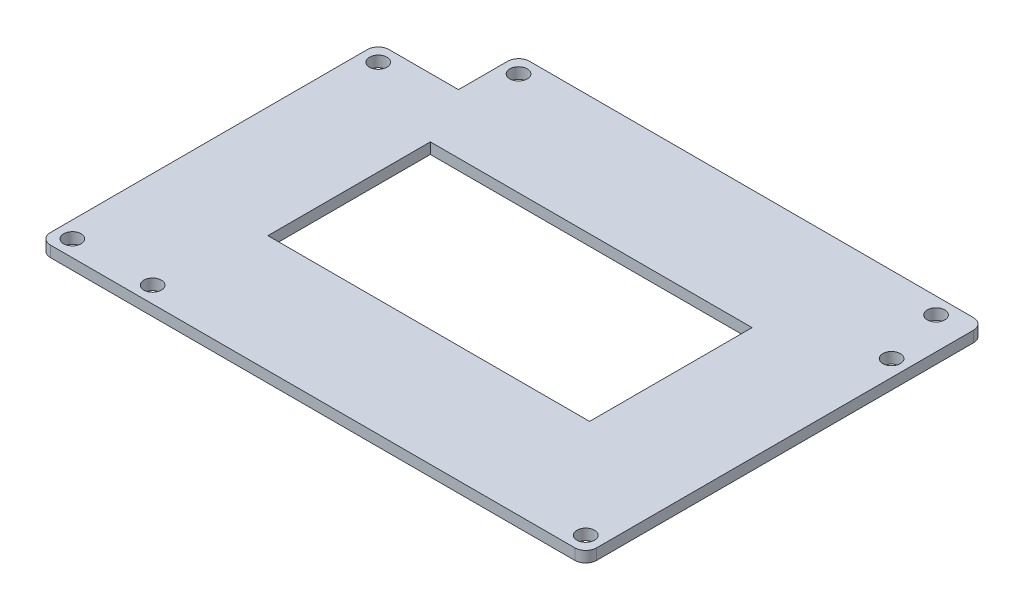
ISO-10303-21;
HEADER;
FILE_DESCRIPTION(('STEP AP214'),'2;1');
FILE_NAME('part.step','',(''),(''),'','','');
FILE_SCHEMA(('AUTOMOTIVE_DESIGN { 1 0 10303 214 1 1 1 1 }'));
ENDSEC;
DATA;
#1=APPLICATION_CONTEXT('core data for automotive mechanical design processes');
#2=APPLICATION_PROTOCOL_DEFINITION('international standard','automotive_design',2000,#1);
#3=PRODUCT_CONTEXT('',#1,'mechanical');
#4=PRODUCT('Part','Part','',(#3));
#5=PRODUCT_RELATED_PRODUCT_CATEGORY('part','',(#4));
#6=PRODUCT_DEFINITION_FORMATION('','',#4);
#7=PRODUCT_DEFINITION_CONTEXT('part definition',#1,'design');
#8=PRODUCT_DEFINITION('design','',#6,#7);
#9=PRODUCT_DEFINITION_SHAPE('','',#8);
#10=(LENGTH_UNIT() NAMED_UNIT(*) SI_UNIT(.MILLI.,.METRE.));
#11=(NAMED_UNIT(*) PLANE_ANGLE_UNIT() SI_UNIT($,.RADIAN.));
#12=(NAMED_UNIT(*) SI_UNIT($,.STERADIAN.) SOLID_ANGLE_UNIT());
#13=UNCERTAINTY_MEASURE_WITH_UNIT(LENGTH_MEASURE(1.E-05),#10,'distance_accuracy_value','');
#14=(GEOMETRIC_REPRESENTATION_CONTEXT(3) GLOBAL_UNCERTAINTY_ASSIGNED_CONTEXT((#13)) GLOBAL_UNIT_ASSIGNED_CONTEXT((#10,
#11,#12)) REPRESENTATION_CONTEXT('',''));
#15=CARTESIAN_POINT('',(0.,0.,0.));
#16=DIRECTION('',(0.,0.,1.));
#17=DIRECTION('',(1.,0.,0.));
#18=AXIS2_PLACEMENT_3D('',#15,#16,#17);
#19=CARTESIAN_POINT('',(50.,2.,0.));
#20=DIRECTION('',(-1.,0.,0.));
#21=DIRECTION('',(0.,0.,1.));
#22=AXIS2_PLACEMENT_3D('',#19,#20,#21);
#23=PLANE('',#22);
#24=DIRECTION('',(0.,0.,-1.));
#25=VECTOR('',#24,1.);
#26=CARTESIAN_POINT('',(50.,0.,0.));
#27=LINE('',#26,#25);
#28=CARTESIAN_POINT('',(50.,0.,29.));
#29=VERTEX_POINT('',#28);
#30=CARTESIAN_POINT('',(50.,0.,-40.));
#31=VERTEX_POINT('',#30);
#32=EDGE_CURVE('E244',#29,#31,#27,.T.);
#33=ORIENTED_EDGE('',*,*,#32,.T.);
#34=DIRECTION('',(0.,-1.,0.));
#35=VECTOR('',#34,1.);
#36=CARTESIAN_POINT('',(50.,2.,-40.));
#37=LINE('',#36,#35);
#38=CARTESIAN_POINT('',(50.,2.,-40.));
#39=VERTEX_POINT('',#38);
#40=EDGE_CURVE('E11',#39,#31,#37,.T.);
#41=ORIENTED_EDGE('',*,*,#40,.F.);
#42=DIRECTION('',(0.,0.,-1.));
#43=VECTOR('',#42,1.);
#44=CARTESIAN_POINT('',(50.,2.,0.));
#45=LINE('',#44,#43);
#46=CARTESIAN_POINT('',(50.,2.,29.));
#47=VERTEX_POINT('',#46);
#48=EDGE_CURVE('E194',#47,#39,#45,.T.);
#49=ORIENTED_EDGE('',*,*,#48,.F.);
#50=DIRECTION('',(0.,-1.,0.));
#51=VECTOR('',#50,1.);
#52=CARTESIAN_POINT('',(50.,2.,29.));
#53=LINE('',#52,#51);
#54=EDGE_CURVE('E235',#47,#29,#53,.T.);
#55=ORIENTED_EDGE('',*,*,#54,.T.);
#56=EDGE_LOOP('',(#33,#41,#49,#55));
#57=FACE_BOUND('',#56,.T.);
#58=ADVANCED_FACE('F41',(#57),#23,.F.);
#59=CARTESIAN_POINT('',(48.,2.,-40.));
#60=DIRECTION('',(0.,-1.,0.));
#61=DIRECTION('',(0.,0.,-1.));
#62=AXIS2_PLACEMENT_3D('',#59,#60,#61);
#63=CYLINDRICAL_SURFACE('',#62,2.);
#64=CARTESIAN_POINT('',(48.,0.,-40.));
#65=DIRECTION('',(0.,1.,0.));
#66=DIRECTION('',(0.,0.,1.));
#67=AXIS2_PLACEMENT_3D('',#64,#65,#66);
#68=CIRCLE('',#67,2.);
#69=CARTESIAN_POINT('',(48.,0.,-42.));
#70=VERTEX_POINT('',#69);
#71=EDGE_CURVE('E247',#70,#31,#68,.F.);
#72=ORIENTED_EDGE('',*,*,#71,.F.);
#73=DIRECTION('',(0.,-1.,0.));
#74=VECTOR('',#73,1.);
#75=CARTESIAN_POINT('',(48.,2.,-42.));
#76=LINE('',#75,#74);
#77=CARTESIAN_POINT('',(48.,2.,-42.));
#78=VERTEX_POINT('',#77);
#79=EDGE_CURVE('E49',#78,#70,#76,.T.);
#80=ORIENTED_EDGE('',*,*,#79,.F.);
#81=CARTESIAN_POINT('',(48.,2.,-40.));
#82=DIRECTION('',(0.,1.,0.));
#83=DIRECTION('',(0.,0.,1.));
#84=AXIS2_PLACEMENT_3D('',#81,#82,#83);
#85=CIRCLE('',#84,2.);
#86=EDGE_CURVE('E196',#78,#39,#85,.F.);
#87=ORIENTED_EDGE('',*,*,#86,.T.);
#88=ORIENTED_EDGE('',*,*,#40,.T.);
#89=EDGE_LOOP('',(#72,#80,#87,#88));
#90=FACE_BOUND('',#89,.T.);
#91=ADVANCED_FACE('F311',(#90),#63,.T.);
#92=CARTESIAN_POINT('',(0.,2.,-42.));
#93=DIRECTION('',(0.,0.,-1.));
#94=DIRECTION('',(-1.,0.,0.));
#95=AXIS2_PLACEMENT_3D('',#92,#93,#94);
#96=PLANE('',#95);
#97=DIRECTION('',(1.,0.,0.));
#98=VECTOR('',#97,1.);
#99=CARTESIAN_POINT('',(0.,0.,-42.));
#100=LINE('',#99,#98);
#101=CARTESIAN_POINT('',(-33.3,0.,-42.));
#102=VERTEX_POINT('',#101);
#103=EDGE_CURVE('E250',#102,#70,#100,.T.);
#104=ORIENTED_EDGE('',*,*,#103,.F.);
#105=DIRECTION('',(0.,-1.,0.));
#106=VECTOR('',#105,1.);
#107=CARTESIAN_POINT('',(-33.3,2.,-42.));
#108=LINE('',#107,#106);
#109=CARTESIAN_POINT('',(-33.3,2.,-42.));
#110=VERTEX_POINT('',#109);
#111=EDGE_CURVE('E303',#110,#102,#108,.T.);
#112=ORIENTED_EDGE('',*,*,#111,.F.);
#113=DIRECTION('',(1.,0.,0.));
#114=VECTOR('',#113,1.);
#115=CARTESIAN_POINT('',(0.,2.,-42.));
#116=LINE('',#115,#114);
#117=EDGE_CURVE('E199',#110,#78,#116,.T.);
#118=ORIENTED_EDGE('',*,*,#117,.T.);
#119=ORIENTED_EDGE('',*,*,#79,.T.);
#120=EDGE_LOOP('',(#104,#112,#118,#119));
#121=FACE_BOUND('',#120,.T.);
#122=ADVANCED_FACE('F307',(#121),#96,.T.);
#123=CARTESIAN_POINT('',(-33.3,2.,-40.));
#124=DIRECTION('',(0.,-1.,0.));
#125=DIRECTION('',(0.,0.,-1.));
#126=AXIS2_PLACEMENT_3D('',#123,#124,#125);
#127=CYLINDRICAL_SURFACE('',#126,2.);
#128=CARTESIAN_POINT('',(-33.3,0.,-40.));
#129=DIRECTION('',(0.,1.,0.));
#130=DIRECTION('',(0.,0.,1.));
#131=AXIS2_PLACEMENT_3D('',#128,#129,#130);
#132=CIRCLE('',#131,2.);
#133=CARTESIAN_POINT('',(-35.3,0.,-40.));
#134=VERTEX_POINT('',#133);
#135=EDGE_CURVE('E253',#134,#102,#132,.F.);
#136=ORIENTED_EDGE('',*,*,#135,.F.);
#137=DIRECTION('',(0.,-1.,0.));
#138=VECTOR('',#137,1.);
#139=CARTESIAN_POINT('',(-35.3,2.,-40.));
#140=LINE('',#139,#138);
#141=CARTESIAN_POINT('',(-35.3,2.,-40.));
#142=VERTEX_POINT('',#141);
#143=EDGE_CURVE('E301',#142,#134,#140,.T.);
#144=ORIENTED_EDGE('',*,*,#143,.F.);
#145=CARTESIAN_POINT('',(-33.3,2.,-40.));
#146=DIRECTION('',(0.,1.,0.));
#147=DIRECTION('',(0.,0.,1.));
#148=AXIS2_PLACEMENT_3D('',#145,#146,#147);
#149=CIRCLE('',#148,2.);
#150=EDGE_CURVE('E202',#142,#110,#149,.F.);
#151=ORIENTED_EDGE('',*,*,#150,.T.);
#152=ORIENTED_EDGE('',*,*,#111,.T.);
#153=EDGE_LOOP('',(#136,#144,#151,#152));
#154=FACE_BOUND('',#153,.T.);
#155=ADVANCED_FACE('F320',(#154),#127,.T.);
#156=CARTESIAN_POINT('',(-35.3,2.,0.));
#157=DIRECTION('',(-1.,0.,0.));
#158=DIRECTION('',(0.,0.,1.));
#159=AXIS2_PLACEMENT_3D('',#156,#157,#158);
#160=PLANE('',#159);
#161=DIRECTION('',(0.,0.,-1.));
#162=VECTOR('',#161,1.);
#163=CARTESIAN_POINT('',(-35.3,0.,0.));
#164=LINE('',#163,#162);
#165=CARTESIAN_POINT('',(-35.3,0.,-31.));
#166=VERTEX_POINT('',#165);
#167=EDGE_CURVE('E256',#166,#134,#164,.T.);
#168=ORIENTED_EDGE('',*,*,#167,.F.);
#169=DIRECTION('',(0.,-1.,0.));
#170=VECTOR('',#169,1.);
#171=CARTESIAN_POINT('',(-35.3,2.,-31.));
#172=LINE('',#171,#170);
#173=CARTESIAN_POINT('',(-35.3,2.,-31.));
#174=VERTEX_POINT('',#173);
#175=EDGE_CURVE('E299',#174,#166,#172,.T.);
#176=ORIENTED_EDGE('',*,*,#175,.F.);
#177=DIRECTION('',(0.,0.,-1.));
#178=VECTOR('',#177,1.);
#179=CARTESIAN_POINT('',(-35.3,2.,0.));
#180=LINE('',#179,#178);
#181=EDGE_CURVE('E205',#174,#142,#180,.T.);
#182=ORIENTED_EDGE('',*,*,#181,.T.);
#183=ORIENTED_EDGE('',*,*,#143,.T.);
#184=EDGE_LOOP('',(#168,#176,#182,#183));
#185=FACE_BOUND('',#184,.T.);
#186=ADVANCED_FACE('F354',(#185),#160,.T.);
#187=CARTESIAN_POINT('',(0.,2.,-31.));
#188=DIRECTION('',(0.,0.,1.));
#189=DIRECTION('',(1.,0.,0.));
#190=AXIS2_PLACEMENT_3D('',#187,#188,#189);
#191=PLANE('',#190);
#192=DIRECTION('',(-1.,0.,0.));
#193=VECTOR('',#192,1.);
#194=CARTESIAN_POINT('',(0.,0.,-31.));
#195=LINE('',#194,#193);
#196=CARTESIAN_POINT('',(-48.,0.,-31.));
#197=VERTEX_POINT('',#196);
#198=EDGE_CURVE('E259',#166,#197,#195,.T.);
#199=ORIENTED_EDGE('',*,*,#198,.T.);
#200=DIRECTION('',(0.,-1.,0.));
#201=VECTOR('',#200,1.);
#202=CARTESIAN_POINT('',(-48.,2.,-31.));
#203=LINE('',#202,#201);
#204=CARTESIAN_POINT('',(-48.,2.,-31.));
#205=VERTEX_POINT('',#204);
#206=EDGE_CURVE('E296',#205,#197,#203,.T.);
#207=ORIENTED_EDGE('',*,*,#206,.F.);
#208=DIRECTION('',(-1.,0.,0.));
#209=VECTOR('',#208,1.);
#210=CARTESIAN_POINT('',(0.,2.,-31.));
#211=LINE('',#210,#209);
#212=EDGE_CURVE('E208',#174,#205,#211,.T.);
#213=ORIENTED_EDGE('',*,*,#212,.F.);
#214=ORIENTED_EDGE('',*,*,#175,.T.);
#215=EDGE_LOOP('',(#199,#207,#213,#214));
#216=FACE_BOUND('',#215,.T.);
#217=ADVANCED_FACE('F352',(#216),#191,.F.);
#218=CARTESIAN_POINT('',(-48.,2.,-29.));
#219=DIRECTION('',(0.,-1.,0.));
#220=DIRECTION('',(0.,0.,-1.));
#221=AXIS2_PLACEMENT_3D('',#218,#219,#220);
#222=CYLINDRICAL_SURFACE('',#221,2.);
#223=CARTESIAN_POINT('',(-48.,0.,-29.));
#224=DIRECTION('',(0.,1.,0.));
#225=DIRECTION('',(0.,0.,1.));
#226=AXIS2_PLACEMENT_3D('',#223,#224,#225);
#227=CIRCLE('',#226,2.);
#228=CARTESIAN_POINT('',(-50.,0.,-29.));
#229=VERTEX_POINT('',#228);
#230=EDGE_CURVE('E261',#197,#229,#227,.T.);
#231=ORIENTED_EDGE('',*,*,#230,.T.);
#232=DIRECTION('',(0.,-1.,0.));
#233=VECTOR('',#232,1.);
#234=CARTESIAN_POINT('',(-50.,2.,-29.));
#235=LINE('',#234,#233);
#236=CARTESIAN_POINT('',(-50.,2.,-29.));
#237=VERTEX_POINT('',#236);
#238=EDGE_CURVE('E294',#237,#229,#235,.T.);
#239=ORIENTED_EDGE('',*,*,#238,.F.);
#240=CARTESIAN_POINT('',(-48.,2.,-29.));
#241=DIRECTION('',(0.,1.,0.));
#242=DIRECTION('',(0.,0.,1.));
#243=AXIS2_PLACEMENT_3D('',#240,#241,#242);
#244=CIRCLE('',#243,2.);
#245=EDGE_CURVE('E210',#205,#237,#244,.T.);
#246=ORIENTED_EDGE('',*,*,#245,.F.);
#247=ORIENTED_EDGE('',*,*,#206,.T.);
#248=EDGE_LOOP('',(#231,#239,#246,#247));
#249=FACE_BOUND('',#248,.T.);
#250=ADVANCED_FACE('F348',(#249),#222,.T.);
#251=CARTESIAN_POINT('',(-50.,2.,0.));
#252=DIRECTION('',(-1.,0.,0.));
#253=DIRECTION('',(0.,0.,1.));
#254=AXIS2_PLACEMENT_3D('',#251,#252,#253);
#255=PLANE('',#254);
#256=DIRECTION('',(0.,0.,-1.));
#257=VECTOR('',#256,1.);
#258=CARTESIAN_POINT('',(-50.,0.,0.));
#259=LINE('',#258,#257);
#260=CARTESIAN_POINT('',(-50.,0.,29.));
#261=VERTEX_POINT('',#260);
#262=EDGE_CURVE('E264',#261,#229,#259,.T.);
#263=ORIENTED_EDGE('',*,*,#262,.F.);
#264=DIRECTION('',(0.,-1.,0.));
#265=VECTOR('',#264,1.);
#266=CARTESIAN_POINT('',(-50.,2.,29.));
#267=LINE('',#266,#265);
#268=CARTESIAN_POINT('',(-50.,2.,29.));
#269=VERTEX_POINT('',#268);
#270=EDGE_CURVE('E292',#269,#261,#267,.T.);
#271=ORIENTED_EDGE('',*,*,#270,.F.);
#272=DIRECTION('',(0.,0.,-1.));
#273=VECTOR('',#272,1.);
#274=CARTESIAN_POINT('',(-50.,2.,0.));
#275=LINE('',#274,#273);
#276=EDGE_CURVE('E212',#269,#237,#275,.T.);
#277=ORIENTED_EDGE('',*,*,#276,.T.);
#278=ORIENTED_EDGE('',*,*,#238,.T.);
#279=EDGE_LOOP('',(#263,#271,#277,#278));
#280=FACE_BOUND('',#279,.T.);
#281=ADVANCED_FACE('F343',(#280),#255,.T.);
#282=CARTESIAN_POINT('',(-48.,2.,29.));
#283=DIRECTION('',(0.,-1.,0.));
#284=DIRECTION('',(0.,0.,-1.));
#285=AXIS2_PLACEMENT_3D('',#282,#283,#284);
#286=CYLINDRICAL_SURFACE('',#285,2.);
#287=CARTESIAN_POINT('',(-48.,0.,29.));
#288=DIRECTION('',(0.,1.,0.));
#289=DIRECTION('',(0.,0.,1.));
#290=AXIS2_PLACEMENT_3D('',#287,#288,#289);
#291=CIRCLE('',#290,2.);
#292=CARTESIAN_POINT('',(-48.,0.,31.));
#293=VERTEX_POINT('',#292);
#294=EDGE_CURVE('E267',#293,#261,#291,.F.);
#295=ORIENTED_EDGE('',*,*,#294,.F.);
#296=DIRECTION('',(0.,-1.,0.));
#297=VECTOR('',#296,1.);
#298=CARTESIAN_POINT('',(-48.,2.,31.));
#299=LINE('',#298,#297);
#300=CARTESIAN_POINT('',(-48.,2.,31.));
#301=VERTEX_POINT('',#300);
#302=EDGE_CURVE('E290',#301,#293,#299,.T.);
#303=ORIENTED_EDGE('',*,*,#302,.F.);
#304=CARTESIAN_POINT('',(-48.,2.,29.));
#305=DIRECTION('',(0.,1.,0.));
#306=DIRECTION('',(0.,0.,1.));
#307=AXIS2_PLACEMENT_3D('',#304,#305,#306);
#308=CIRCLE('',#307,2.);
#309=EDGE_CURVE('E215',#301,#269,#308,.F.);
#310=ORIENTED_EDGE('',*,*,#309,.T.);
#311=ORIENTED_EDGE('',*,*,#270,.T.);
#312=EDGE_LOOP('',(#295,#303,#310,#311));
#313=FACE_BOUND('',#312,.T.);
#314=ADVANCED_FACE('F339',(#313),#286,.T.);
#315=CARTESIAN_POINT('',(0.,2.,31.));
#316=DIRECTION('',(0.,0.,1.));
#317=DIRECTION('',(1.,0.,0.));
#318=AXIS2_PLACEMENT_3D('',#315,#316,#317);
#319=PLANE('',#318);
#320=DIRECTION('',(-1.,0.,0.));
#321=VECTOR('',#320,1.);
#322=CARTESIAN_POINT('',(0.,0.,31.));
#323=LINE('',#322,#321);
#324=CARTESIAN_POINT('',(48.,0.,31.));
#325=VERTEX_POINT('',#324);
#326=EDGE_CURVE('E270',#325,#293,#323,.T.);
#327=ORIENTED_EDGE('',*,*,#326,.F.);
#328=DIRECTION('',(0.,-1.,0.));
#329=VECTOR('',#328,1.);
#330=CARTESIAN_POINT('',(48.,2.,31.));
#331=LINE('',#330,#329);
#332=CARTESIAN_POINT('',(48.,2.,31.));
#333=VERTEX_POINT('',#332);
#334=EDGE_CURVE('E288',#333,#325,#331,.T.);
#335=ORIENTED_EDGE('',*,*,#334,.F.);
#336=DIRECTION('',(-1.,0.,0.));
#337=VECTOR('',#336,1.);
#338=CARTESIAN_POINT('',(0.,2.,31.));
#339=LINE('',#338,#337);
#340=EDGE_CURVE('E218',#333,#301,#339,.T.);
#341=ORIENTED_EDGE('',*,*,#340,.T.);
#342=ORIENTED_EDGE('',*,*,#302,.T.);
#343=EDGE_LOOP('',(#327,#335,#341,#342));
#344=FACE_BOUND('',#343,.T.);
#345=ADVANCED_FACE('F335',(#344),#319,.T.);
#346=CARTESIAN_POINT('',(44.1444522315635,2.,-39.));
#347=DIRECTION('',(0.,-1.,0.));
#348=DIRECTION('',(0.,0.,-1.));
#349=AXIS2_PLACEMENT_3D('',#346,#347,#348);
#350=CYLINDRICAL_SURFACE('',#349,1.6);
#351=CARTESIAN_POINT('',(44.1444522315635,2.,-39.));
#352=DIRECTION('',(0.,1.,0.));
#353=DIRECTION('',(0.,0.,1.));
#354=AXIS2_PLACEMENT_3D('',#351,#352,#353);
#355=CIRCLE('',#354,1.6);
#356=CARTESIAN_POINT('',(44.1444522315635,2.,-37.4));
#357=VERTEX_POINT('',#356);
#358=EDGE_CURVE('E229',#357,#357,#355,.T.);
#359=ORIENTED_EDGE('',*,*,#358,.T.);
#360=EDGE_LOOP('',(#359));
#361=FACE_BOUND('',#360,.T.);
#362=CARTESIAN_POINT('',(44.1444522315635,0.,-39.));
#363=DIRECTION('',(0.,1.,0.));
#364=DIRECTION('',(0.,0.,1.));
#365=AXIS2_PLACEMENT_3D('',#362,#363,#364);
#366=CIRCLE('',#365,1.6);
#367=CARTESIAN_POINT('',(44.1444522315635,0.,-37.4));
#368=VERTEX_POINT('',#367);
#369=EDGE_CURVE('E281',#368,#368,#366,.T.);
#370=ORIENTED_EDGE('',*,*,#369,.F.);
#371=EDGE_LOOP('',(#370));
#372=FACE_BOUND('',#371,.T.);
#373=ADVANCED_FACE('F405',(#361,#372),#350,.F.);
#374=CARTESIAN_POINT('',(-47.,2.,28.));
#375=DIRECTION('',(0.,-1.,0.));
#376=DIRECTION('',(0.,0.,-1.));
#377=AXIS2_PLACEMENT_3D('',#374,#375,#376);
#378=CYLINDRICAL_SURFACE('',#377,1.6);
#379=CARTESIAN_POINT('',(-47.,2.,28.));
#380=DIRECTION('',(0.,1.,0.));
#381=DIRECTION('',(0.,0.,1.));
#382=AXIS2_PLACEMENT_3D('',#379,#380,#381);
#383=CIRCLE('',#382,1.6);
#384=CARTESIAN_POINT('',(-47.,2.,29.6));
#385=VERTEX_POINT('',#384);
#386=EDGE_CURVE('E226',#385,#385,#383,.T.);
#387=ORIENTED_EDGE('',*,*,#386,.T.);
#388=EDGE_LOOP('',(#387));
#389=FACE_BOUND('',#388,.T.);
#390=CARTESIAN_POINT('',(-47.,0.,28.));
#391=DIRECTION('',(0.,1.,0.));
#392=DIRECTION('',(0.,0.,1.));
#393=AXIS2_PLACEMENT_3D('',#390,#391,#392);
#394=CIRCLE('',#393,1.6);
#395=CARTESIAN_POINT('',(-47.,0.,29.6));
#396=VERTEX_POINT('',#395);
#397=EDGE_CURVE('E278',#396,#396,#394,.T.);
#398=ORIENTED_EDGE('',*,*,#397,.F.);
#399=EDGE_LOOP('',(#398));
#400=FACE_BOUND('',#399,.T.);
#401=ADVANCED_FACE('F408',(#389,#400),#378,.F.);
#402=CARTESIAN_POINT('',(-47.,2.,-28.));
#403=DIRECTION('',(0.,-1.,0.));
#404=DIRECTION('',(0.,0.,-1.));
#405=AXIS2_PLACEMENT_3D('',#402,#403,#404);
#406=CYLINDRICAL_SURFACE('',#405,1.6);
#407=CARTESIAN_POINT('',(-47.,2.,-28.));
#408=DIRECTION('',(0.,1.,0.));
#409=DIRECTION('',(0.,0.,1.));
#410=AXIS2_PLACEMENT_3D('',#407,#408,#409);
#411=CIRCLE('',#410,1.6);
#412=CARTESIAN_POINT('',(-47.,2.,-26.4));
#413=VERTEX_POINT('',#412);
#414=EDGE_CURVE('E223',#413,#413,#411,.T.);
#415=ORIENTED_EDGE('',*,*,#414,.T.);
#416=EDGE_LOOP('',(#415));
#417=FACE_BOUND('',#416,.T.);
#418=CARTESIAN_POINT('',(-47.,0.,-28.));
#419=DIRECTION('',(0.,1.,0.));
#420=DIRECTION('',(0.,0.,1.));
#421=AXIS2_PLACEMENT_3D('',#418,#419,#420);
#422=CIRCLE('',#421,1.6);
#423=CARTESIAN_POINT('',(-47.,0.,-26.4));
#424=VERTEX_POINT('',#423);
#425=EDGE_CURVE('E275',#424,#424,#422,.T.);
#426=ORIENTED_EDGE('',*,*,#425,.F.);
#427=EDGE_LOOP('',(#426));
#428=FACE_BOUND('',#427,.T.);
#429=ADVANCED_FACE('F412',(#417,#428),#406,.F.);
#430=CARTESIAN_POINT('',(48.,2.,29.));
#431=DIRECTION('',(0.,-1.,0.));
#432=DIRECTION('',(0.,0.,-1.));
#433=AXIS2_PLACEMENT_3D('',#430,#431,#432);
#434=CYLINDRICAL_SURFACE('',#433,2.);
#435=CARTESIAN_POINT('',(48.,0.,29.));
#436=DIRECTION('',(0.,1.,0.));
#437=DIRECTION('',(0.,0.,1.));
#438=AXIS2_PLACEMENT_3D('',#435,#436,#437);
#439=CIRCLE('',#438,2.);
#440=EDGE_CURVE('E273',#325,#29,#439,.T.);
#441=ORIENTED_EDGE('',*,*,#440,.T.);
#442=ORIENTED_EDGE('',*,*,#54,.F.);
#443=CARTESIAN_POINT('',(48.,2.,29.));
#444=DIRECTION('',(0.,1.,0.));
#445=DIRECTION('',(0.,0.,1.));
#446=AXIS2_PLACEMENT_3D('',#443,#444,#445);
#447=CIRCLE('',#446,2.);
#448=EDGE_CURVE('E221',#333,#47,#447,.T.);
#449=ORIENTED_EDGE('',*,*,#448,.F.);
#450=ORIENTED_EDGE('',*,*,#334,.T.);
#451=EDGE_LOOP('',(#441,#442,#449,#450));
#452=FACE_BOUND('',#451,.T.);
#453=ADVANCED_FACE('F374',(#452),#434,.T.);
#454=CARTESIAN_POINT('',(47.,2.,28.));
#455=DIRECTION('',(0.,-1.,0.));
#456=DIRECTION('',(0.,0.,-1.));
#457=AXIS2_PLACEMENT_3D('',#454,#455,#456);
#458=CYLINDRICAL_SURFACE('',#457,1.6);
#459=CARTESIAN_POINT('',(47.,2.,28.));
#460=DIRECTION('',(0.,1.,0.));
#461=DIRECTION('',(0.,0.,1.));
#462=AXIS2_PLACEMENT_3D('',#459,#460,#461);
#463=CIRCLE('',#462,1.6);
#464=CARTESIAN_POINT('',(47.,2.,29.6));
#465=VERTEX_POINT('',#464);
#466=EDGE_CURVE('E191',#465,#465,#463,.F.);
#467=ORIENTED_EDGE('',*,*,#466,.F.);
#468=EDGE_LOOP('',(#467));
#469=FACE_BOUND('',#468,.T.);
#470=CARTESIAN_POINT('',(47.,0.,28.));
#471=DIRECTION('',(0.,1.,0.));
#472=DIRECTION('',(0.,0.,1.));
#473=AXIS2_PLACEMENT_3D('',#470,#471,#472);
#474=CIRCLE('',#473,1.6);
#475=CARTESIAN_POINT('',(47.,0.,29.6));
#476=VERTEX_POINT('',#475);
#477=EDGE_CURVE('E241',#476,#476,#474,.F.);
#478=ORIENTED_EDGE('',*,*,#477,.T.);
#479=EDGE_LOOP('',(#478));
#480=FACE_BOUND('',#479,.T.);
#481=ADVANCED_FACE('F371',(#469,#480),#458,.F.);
#482=CARTESIAN_POINT('',(47.,2.,-28.));
#483=DIRECTION('',(0.,-1.,0.));
#484=DIRECTION('',(0.,0.,-1.));
#485=AXIS2_PLACEMENT_3D('',#482,#483,#484);
#486=CYLINDRICAL_SURFACE('',#485,1.6);
#487=CARTESIAN_POINT('',(47.,2.,-28.));
#488=DIRECTION('',(0.,1.,0.));
#489=DIRECTION('',(0.,0.,1.));
#490=AXIS2_PLACEMENT_3D('',#487,#488,#489);
#491=CIRCLE('',#490,1.6);
#492=CARTESIAN_POINT('',(47.,2.,-26.4));
#493=VERTEX_POINT('',#492);
#494=EDGE_CURVE('E187',#493,#493,#491,.F.);
#495=ORIENTED_EDGE('',*,*,#494,.F.);
#496=EDGE_LOOP('',(#495));
#497=FACE_BOUND('',#496,.T.);
#498=CARTESIAN_POINT('',(47.,0.,-28.));
#499=DIRECTION('',(0.,1.,0.));
#500=DIRECTION('',(0.,0.,1.));
#501=AXIS2_PLACEMENT_3D('',#498,#499,#500);
#502=CIRCLE('',#501,1.6);
#503=CARTESIAN_POINT('',(47.,0.,-26.4));
#504=VERTEX_POINT('',#503);
#505=EDGE_CURVE('E238',#504,#504,#502,.F.);
#506=ORIENTED_EDGE('',*,*,#505,.T.);
#507=EDGE_LOOP('',(#506));
#508=FACE_BOUND('',#507,.T.);
#509=ADVANCED_FACE('F373',(#497,#508),#486,.F.);
#510=CARTESIAN_POINT('',(-32.3,2.,28.));
#511=DIRECTION('',(0.,-1.,0.));
#512=DIRECTION('',(0.,0.,-1.));
#513=AXIS2_PLACEMENT_3D('',#510,#511,#512);
#514=CYLINDRICAL_SURFACE('',#513,1.6);
#515=CARTESIAN_POINT('',(-32.3,2.,28.));
#516=DIRECTION('',(0.,1.,0.));
#517=DIRECTION('',(0.,0.,1.));
#518=AXIS2_PLACEMENT_3D('',#515,#516,#517);
#519=CIRCLE('',#518,1.6);
#520=CARTESIAN_POINT('',(-32.3,2.,29.6));
#521=VERTEX_POINT('',#520);
#522=EDGE_CURVE('E184',#521,#521,#519,.T.);
#523=ORIENTED_EDGE('',*,*,#522,.T.);
#524=EDGE_LOOP('',(#523));
#525=FACE_BOUND('',#524,.T.);
#526=CARTESIAN_POINT('',(-32.3,0.,28.));
#527=DIRECTION('',(0.,1.,0.));
#528=DIRECTION('',(0.,0.,1.));
#529=AXIS2_PLACEMENT_3D('',#526,#527,#528);
#530=CIRCLE('',#529,1.6);
#531=CARTESIAN_POINT('',(-32.3,0.,29.6));
#532=VERTEX_POINT('',#531);
#533=EDGE_CURVE('E161',#532,#532,#530,.T.);
#534=ORIENTED_EDGE('',*,*,#533,.F.);
#535=EDGE_LOOP('',(#534));
#536=FACE_BOUND('',#535,.T.);
#537=ADVANCED_FACE('F43',(#525,#536),#514,.F.);
#538=CARTESIAN_POINT('',(-32.3,2.,-39.0000000000001));
#539=DIRECTION('',(0.,-1.,0.));
#540=DIRECTION('',(0.,0.,-1.));
#541=AXIS2_PLACEMENT_3D('',#538,#539,#540);
#542=CYLINDRICAL_SURFACE('',#541,1.6);
#543=CARTESIAN_POINT('',(-32.3,2.,-39.0000000000001));
#544=DIRECTION('',(0.,1.,0.));
#545=DIRECTION('',(0.,0.,1.));
#546=AXIS2_PLACEMENT_3D('',#543,#544,#545);
#547=CIRCLE('',#546,1.6);
#548=CARTESIAN_POINT('',(-32.3,2.,-37.4000000000001));
#549=VERTEX_POINT('',#548);
#550=EDGE_CURVE('E232',#549,#549,#547,.T.);
#551=ORIENTED_EDGE('',*,*,#550,.T.);
#552=EDGE_LOOP('',(#551));
#553=FACE_BOUND('',#552,.T.);
#554=CARTESIAN_POINT('',(-32.3,0.,-39.0000000000001));
#555=DIRECTION('',(0.,1.,0.));
#556=DIRECTION('',(0.,0.,1.));
#557=AXIS2_PLACEMENT_3D('',#554,#555,#556);
#558=CIRCLE('',#557,1.6);
#559=CARTESIAN_POINT('',(-32.3,0.,-37.4000000000001));
#560=VERTEX_POINT('',#559);
#561=EDGE_CURVE('E188',#560,#560,#558,.T.);
#562=ORIENTED_EDGE('',*,*,#561,.F.);
#563=EDGE_LOOP('',(#562));
#564=FACE_BOUND('',#563,.T.);
#565=ADVANCED_FACE('F381',(#553,#564),#542,.F.);
#566=CARTESIAN_POINT('',(0.,2.,0.));
#567=DIRECTION('',(0.,1.,0.));
#568=DIRECTION('',(0.,0.,1.));
#569=AXIS2_PLACEMENT_3D('',#566,#567,#568);
#570=PLANE('',#569);
#571=DIRECTION('',(0.,0.,1.));
#572=VECTOR('',#571,1.);
#573=CARTESIAN_POINT('',(-29.5925030851549,2.,-20.1422487286891));
#574=LINE('',#573,#572);
#575=CARTESIAN_POINT('',(-29.5925030851549,2.,-20.1422487286891));
#576=VERTEX_POINT('',#575);
#577=CARTESIAN_POINT('',(-29.5925030851549,2.,9.60339858352199));
#578=VERTEX_POINT('',#577);
#579=EDGE_CURVE('E56',#576,#578,#574,.T.);
#580=ORIENTED_EDGE('',*,*,#579,.F.);
#581=DIRECTION('',(-1.,0.,0.));
#582=VECTOR('',#581,1.);
#583=CARTESIAN_POINT('',(-29.5925030851549,2.,-20.1422487286891));
#584=LINE('',#583,#582);
#585=CARTESIAN_POINT('',(29.3096703132107,2.,-20.1422487286891));
#586=VERTEX_POINT('',#585);
#587=EDGE_CURVE('E155',#586,#576,#584,.T.);
#588=ORIENTED_EDGE('',*,*,#587,.F.);
#589=DIRECTION('',(0.,0.,-1.));
#590=VECTOR('',#589,1.);
#591=CARTESIAN_POINT('',(29.3096703132107,2.,-20.1422487286891));
#592=LINE('',#591,#590);
#593=CARTESIAN_POINT('',(29.3096703132107,2.,9.60339858352199));
#594=VERTEX_POINT('',#593);
#595=EDGE_CURVE('E175',#594,#586,#592,.T.);
#596=ORIENTED_EDGE('',*,*,#595,.F.);
#597=DIRECTION('',(1.,0.,0.));
#598=VECTOR('',#597,1.);
#599=CARTESIAN_POINT('',(-29.5925030851549,2.,9.60339858352199));
#600=LINE('',#599,#598);
#601=EDGE_CURVE('E169',#578,#594,#600,.T.);
#602=ORIENTED_EDGE('',*,*,#601,.F.);
#603=EDGE_LOOP('',(#580,#588,#596,#602));
#604=FACE_BOUND('',#603,.T.);
#605=ORIENTED_EDGE('',*,*,#522,.F.);
#606=EDGE_LOOP('',(#605));
#607=FACE_BOUND('',#606,.T.);
#608=ORIENTED_EDGE('',*,*,#494,.T.);
#609=EDGE_LOOP('',(#608));
#610=FACE_BOUND('',#609,.T.);
#611=ORIENTED_EDGE('',*,*,#466,.T.);
#612=EDGE_LOOP('',(#611));
#613=FACE_BOUND('',#612,.T.);
#614=ORIENTED_EDGE('',*,*,#48,.T.);
#615=ORIENTED_EDGE('',*,*,#86,.F.);
#616=ORIENTED_EDGE('',*,*,#117,.F.);
#617=ORIENTED_EDGE('',*,*,#150,.F.);
#618=ORIENTED_EDGE('',*,*,#181,.F.);
#619=ORIENTED_EDGE('',*,*,#212,.T.);
#620=ORIENTED_EDGE('',*,*,#245,.T.);
#621=ORIENTED_EDGE('',*,*,#276,.F.);
#622=ORIENTED_EDGE('',*,*,#309,.F.);
#623=ORIENTED_EDGE('',*,*,#340,.F.);
#624=ORIENTED_EDGE('',*,*,#448,.T.);
#625=EDGE_LOOP('',(#614,#615,#616,#617,#618,#619,#620,#621,#622,#623,#624));
#626=FACE_BOUND('',#625,.T.);
#627=ORIENTED_EDGE('',*,*,#414,.F.);
#628=EDGE_LOOP('',(#627));
#629=FACE_BOUND('',#628,.T.);
#630=ORIENTED_EDGE('',*,*,#386,.F.);
#631=EDGE_LOOP('',(#630));
#632=FACE_BOUND('',#631,.T.);
#633=ORIENTED_EDGE('',*,*,#358,.F.);
#634=EDGE_LOOP('',(#633));
#635=FACE_BOUND('',#634,.T.);
#636=ORIENTED_EDGE('',*,*,#550,.F.);
#637=EDGE_LOOP('',(#636));
#638=FACE_BOUND('',#637,.T.);
#639=ADVANCED_FACE('F323',(#604,#607,#610,#613,#626,#629,#632,#635,#638),#570,.T.);
#640=CARTESIAN_POINT('',(0.,0.,0.));
#641=DIRECTION('',(0.,1.,0.));
#642=DIRECTION('',(0.,0.,1.));
#643=AXIS2_PLACEMENT_3D('',#640,#641,#642);
#644=PLANE('',#643);
#645=DIRECTION('',(1.,0.,0.));
#646=VECTOR('',#645,1.);
#647=CARTESIAN_POINT('',(-29.5925030851549,0.,-20.1422487286891));
#648=LINE('',#647,#646);
#649=CARTESIAN_POINT('',(-29.5925030851549,0.,-20.1422487286891));
#650=VERTEX_POINT('',#649);
#651=CARTESIAN_POINT('',(29.3096703132107,0.,-20.1422487286891));
#652=VERTEX_POINT('',#651);
#653=EDGE_CURVE('E167',#650,#652,#648,.T.);
#654=ORIENTED_EDGE('',*,*,#653,.F.);
#655=DIRECTION('',(0.,0.,-1.));
#656=VECTOR('',#655,1.);
#657=CARTESIAN_POINT('',(-29.5925030851549,0.,-20.1422487286891));
#658=LINE('',#657,#656);
#659=CARTESIAN_POINT('',(-29.5925030851549,0.,9.60339858352199));
#660=VERTEX_POINT('',#659);
#661=EDGE_CURVE('E149',#660,#650,#658,.T.);
#662=ORIENTED_EDGE('',*,*,#661,.F.);
#663=DIRECTION('',(-1.,0.,0.));
#664=VECTOR('',#663,1.);
#665=CARTESIAN_POINT('',(-29.5925030851549,0.,9.60339858352199));
#666=LINE('',#665,#664);
#667=CARTESIAN_POINT('',(29.3096703132107,0.,9.60339858352199));
#668=VERTEX_POINT('',#667);
#669=EDGE_CURVE('E158',#668,#660,#666,.T.);
#670=ORIENTED_EDGE('',*,*,#669,.F.);
#671=DIRECTION('',(0.,0.,1.));
#672=VECTOR('',#671,1.);
#673=CARTESIAN_POINT('',(29.3096703132107,0.,-20.1422487286891));
#674=LINE('',#673,#672);
#675=EDGE_CURVE('E64',#652,#668,#674,.T.);
#676=ORIENTED_EDGE('',*,*,#675,.F.);
#677=EDGE_LOOP('',(#654,#662,#670,#676));
#678=FACE_BOUND('',#677,.T.);
#679=ORIENTED_EDGE('',*,*,#533,.T.);
#680=EDGE_LOOP('',(#679));
#681=FACE_BOUND('',#680,.T.);
#682=ORIENTED_EDGE('',*,*,#505,.F.);
#683=EDGE_LOOP('',(#682));
#684=FACE_BOUND('',#683,.T.);
#685=ORIENTED_EDGE('',*,*,#477,.F.);
#686=EDGE_LOOP('',(#685));
#687=FACE_BOUND('',#686,.T.);
#688=ORIENTED_EDGE('',*,*,#32,.F.);
#689=ORIENTED_EDGE('',*,*,#440,.F.);
#690=ORIENTED_EDGE('',*,*,#326,.T.);
#691=ORIENTED_EDGE('',*,*,#294,.T.);
#692=ORIENTED_EDGE('',*,*,#262,.T.);
#693=ORIENTED_EDGE('',*,*,#230,.F.);
#694=ORIENTED_EDGE('',*,*,#198,.F.);
#695=ORIENTED_EDGE('',*,*,#167,.T.);
#696=ORIENTED_EDGE('',*,*,#135,.T.);
#697=ORIENTED_EDGE('',*,*,#103,.T.);
#698=ORIENTED_EDGE('',*,*,#71,.T.);
#699=EDGE_LOOP('',(#688,#689,#690,#691,#692,#693,#694,#695,#696,#697,#698));
#700=FACE_BOUND('',#699,.T.);
#701=ORIENTED_EDGE('',*,*,#425,.T.);
#702=EDGE_LOOP('',(#701));
#703=FACE_BOUND('',#702,.T.);
#704=ORIENTED_EDGE('',*,*,#397,.T.);
#705=EDGE_LOOP('',(#704));
#706=FACE_BOUND('',#705,.T.);
#707=ORIENTED_EDGE('',*,*,#369,.T.);
#708=EDGE_LOOP('',(#707));
#709=FACE_BOUND('',#708,.T.);
#710=ORIENTED_EDGE('',*,*,#561,.T.);
#711=EDGE_LOOP('',(#710));
#712=FACE_BOUND('',#711,.T.);
#713=ADVANCED_FACE('F164',(#678,#681,#684,#687,#700,#703,#706,#709,#712),#644,.F.);
#714=CARTESIAN_POINT('',(-29.5925030851549,-0.00100000000000013,-20.1422487286891));
#715=DIRECTION('',(-1.,0.,0.));
#716=DIRECTION('',(0.,0.,1.));
#717=AXIS2_PLACEMENT_3D('',#714,#715,#716);
#718=PLANE('',#717);
#719=ORIENTED_EDGE('',*,*,#661,.T.);
#720=DIRECTION('',(0.,1.,0.));
#721=VECTOR('',#720,1.);
#722=CARTESIAN_POINT('',(-29.5925030851549,-0.00100000000000013,-20.1422487286891));
#723=LINE('',#722,#721);
#724=EDGE_CURVE('E162',#650,#576,#723,.T.);
#725=ORIENTED_EDGE('',*,*,#724,.T.);
#726=ORIENTED_EDGE('',*,*,#579,.T.);
#727=DIRECTION('',(0.,1.,0.));
#728=VECTOR('',#727,1.);
#729=CARTESIAN_POINT('',(-29.5925030851549,-0.00100000000000013,9.60339858352199));
#730=LINE('',#729,#728);
#731=EDGE_CURVE('E145',#660,#578,#730,.T.);
#732=ORIENTED_EDGE('',*,*,#731,.F.);
#733=EDGE_LOOP('',(#719,#725,#726,#732));
#734=FACE_BOUND('',#733,.T.);
#735=ADVANCED_FACE('F147',(#734),#718,.F.);
#736=CARTESIAN_POINT('',(-29.5925030851549,-0.00100000000000013,-20.1422487286891));
#737=DIRECTION('',(0.,0.,-1.));
#738=DIRECTION('',(-1.,0.,0.));
#739=AXIS2_PLACEMENT_3D('',#736,#737,#738);
#740=PLANE('',#739);
#741=ORIENTED_EDGE('',*,*,#653,.T.);
#742=DIRECTION('',(0.,1.,0.));
#743=VECTOR('',#742,1.);
#744=CARTESIAN_POINT('',(29.3096703132107,-0.00100000000000013,-20.1422487286891));
#745=LINE('',#744,#743);
#746=EDGE_CURVE('E181',#652,#586,#745,.T.);
#747=ORIENTED_EDGE('',*,*,#746,.T.);
#748=ORIENTED_EDGE('',*,*,#587,.T.);
#749=ORIENTED_EDGE('',*,*,#724,.F.);
#750=EDGE_LOOP('',(#741,#747,#748,#749));
#751=FACE_BOUND('',#750,.T.);
#752=ADVANCED_FACE('F397',(#751),#740,.F.);
#753=CARTESIAN_POINT('',(29.3096703132107,-0.00100000000000013,-20.1422487286891));
#754=DIRECTION('',(1.,0.,0.));
#755=DIRECTION('',(0.,0.,-1.));
#756=AXIS2_PLACEMENT_3D('',#753,#754,#755);
#757=PLANE('',#756);
#758=ORIENTED_EDGE('',*,*,#675,.T.);
#759=DIRECTION('',(0.,1.,0.));
#760=VECTOR('',#759,1.);
#761=CARTESIAN_POINT('',(29.3096703132107,-0.00100000000000013,9.60339858352199));
#762=LINE('',#761,#760);
#763=EDGE_CURVE('E154',#668,#594,#762,.T.);
#764=ORIENTED_EDGE('',*,*,#763,.T.);
#765=ORIENTED_EDGE('',*,*,#595,.T.);
#766=ORIENTED_EDGE('',*,*,#746,.F.);
#767=EDGE_LOOP('',(#758,#764,#765,#766));
#768=FACE_BOUND('',#767,.T.);
#769=ADVANCED_FACE('F507',(#768),#757,.F.);
#770=CARTESIAN_POINT('',(-29.5925030851549,-0.00100000000000013,9.60339858352199));
#771=DIRECTION('',(0.,0.,1.));
#772=DIRECTION('',(1.,0.,0.));
#773=AXIS2_PLACEMENT_3D('',#770,#771,#772);
#774=PLANE('',#773);
#775=ORIENTED_EDGE('',*,*,#669,.T.);
#776=ORIENTED_EDGE('',*,*,#731,.T.);
#777=ORIENTED_EDGE('',*,*,#601,.T.);
#778=ORIENTED_EDGE('',*,*,#763,.F.);
#779=EDGE_LOOP('',(#775,#776,#777,#778));
#780=FACE_BOUND('',#779,.T.);
#781=ADVANCED_FACE('F159',(#780),#774,.F.);
#782=CLOSED_SHELL('',(#58,#91,#122,#155,#186,#217,#250,#281,#314,#345,#373,#401,#429,#453,#481,
#509,#537,#565,#639,#713,#735,#752,#769,#781));
#783=MANIFOLD_SOLID_BREP('B2',#782);
#784=ADVANCED_BREP_SHAPE_REPRESENTATION('',(#18,#783),#14);
#785=SHAPE_DEFINITION_REPRESENTATION(#9,#784);
ENDSEC;
END-ISO-10303-21;
